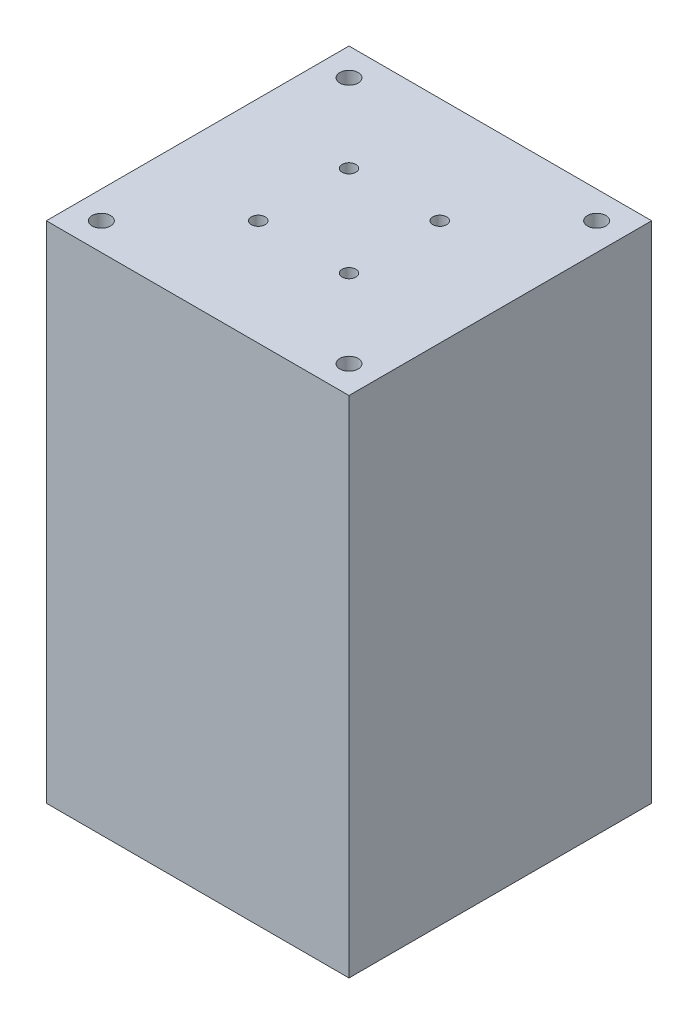
ISO-10303-21;
HEADER;
FILE_DESCRIPTION(('STEP AP214'),'2;1');
FILE_NAME('part.step','',(''),(''),'','','');
FILE_SCHEMA(('AUTOMOTIVE_DESIGN { 1 0 10303 214 1 1 1 1 }'));
ENDSEC;
DATA;
#1=APPLICATION_CONTEXT('core data for automotive mechanical design processes');
#2=APPLICATION_PROTOCOL_DEFINITION('international standard','automotive_design',2000,#1);
#3=PRODUCT_CONTEXT('',#1,'mechanical');
#4=PRODUCT('Part','Part','',(#3));
#5=PRODUCT_RELATED_PRODUCT_CATEGORY('part','',(#4));
#6=PRODUCT_DEFINITION_FORMATION('','',#4);
#7=PRODUCT_DEFINITION_CONTEXT('part definition',#1,'design');
#8=PRODUCT_DEFINITION('design','',#6,#7);
#9=PRODUCT_DEFINITION_SHAPE('','',#8);
#10=(LENGTH_UNIT() NAMED_UNIT(*) SI_UNIT(.MILLI.,.METRE.));
#11=(NAMED_UNIT(*) PLANE_ANGLE_UNIT() SI_UNIT($,.RADIAN.));
#12=(NAMED_UNIT(*) SI_UNIT($,.STERADIAN.) SOLID_ANGLE_UNIT());
#13=UNCERTAINTY_MEASURE_WITH_UNIT(LENGTH_MEASURE(1.E-05),#10,'distance_accuracy_value','');
#14=(GEOMETRIC_REPRESENTATION_CONTEXT(3) GLOBAL_UNCERTAINTY_ASSIGNED_CONTEXT((#13)) GLOBAL_UNIT_ASSIGNED_CONTEXT((#10,
#11,#12)) REPRESENTATION_CONTEXT('',''));
#15=CARTESIAN_POINT('',(0.,0.,0.));
#16=DIRECTION('',(0.,0.,1.));
#17=DIRECTION('',(1.,0.,0.));
#18=AXIS2_PLACEMENT_3D('',#15,#16,#17);
#19=CARTESIAN_POINT('',(0.,0.,0.));
#20=DIRECTION('',(0.,1.,0.));
#21=DIRECTION('',(0.,0.,1.));
#22=AXIS2_PLACEMENT_3D('',#19,#20,#21);
#23=PLANE('',#22);
#24=CARTESIAN_POINT('',(27.,0.,-27.));
#25=DIRECTION('',(0.,1.,0.));
#26=DIRECTION('',(0.,0.,1.));
#27=AXIS2_PLACEMENT_3D('',#24,#25,#26);
#28=CIRCLE('',#27,2.);
#29=CARTESIAN_POINT('',(27.,0.,-25.));
#30=VERTEX_POINT('',#29);
#31=EDGE_CURVE('E347',#30,#30,#28,.T.);
#32=ORIENTED_EDGE('',*,*,#31,.T.);
#33=EDGE_LOOP('',(#32));
#34=FACE_BOUND('',#33,.T.);
#35=CARTESIAN_POINT('',(-27.,0.,27.));
#36=DIRECTION('',(0.,1.,0.));
#37=DIRECTION('',(0.,0.,1.));
#38=AXIS2_PLACEMENT_3D('',#35,#36,#37);
#39=CIRCLE('',#38,2.);
#40=CARTESIAN_POINT('',(-27.,0.,29.));
#41=VERTEX_POINT('',#40);
#42=EDGE_CURVE('E338',#41,#41,#39,.T.);
#43=ORIENTED_EDGE('',*,*,#42,.T.);
#44=EDGE_LOOP('',(#43));
#45=FACE_BOUND('',#44,.T.);
#46=CARTESIAN_POINT('',(27.,0.,27.));
#47=DIRECTION('',(0.,1.,0.));
#48=DIRECTION('',(0.,0.,1.));
#49=AXIS2_PLACEMENT_3D('',#46,#47,#48);
#50=CIRCLE('',#49,2.);
#51=CARTESIAN_POINT('',(27.,0.,29.));
#52=VERTEX_POINT('',#51);
#53=EDGE_CURVE('E333',#52,#52,#50,.T.);
#54=ORIENTED_EDGE('',*,*,#53,.T.);
#55=EDGE_LOOP('',(#54));
#56=FACE_BOUND('',#55,.T.);
#57=DIRECTION('',(0.,0.,1.));
#58=VECTOR('',#57,1.);
#59=CARTESIAN_POINT('',(-33.,0.,0.));
#60=LINE('',#59,#58);
#61=CARTESIAN_POINT('',(-33.,0.,12.5));
#62=VERTEX_POINT('',#61);
#63=CARTESIAN_POINT('',(-33.,0.,33.));
#64=VERTEX_POINT('',#63);
#65=EDGE_CURVE('E456',#62,#64,#60,.T.);
#66=ORIENTED_EDGE('',*,*,#65,.F.);
#67=DIRECTION('',(-1.,0.,0.));
#68=VECTOR('',#67,1.);
#69=CARTESIAN_POINT('',(33.001,0.,12.5));
#70=LINE('',#69,#68);
#71=CARTESIAN_POINT('',(-21.,0.,12.5));
#72=VERTEX_POINT('',#71);
#73=EDGE_CURVE('E273',#72,#62,#70,.T.);
#74=ORIENTED_EDGE('',*,*,#73,.F.);
#75=DIRECTION('',(0.,0.,-1.));
#76=VECTOR('',#75,1.);
#77=CARTESIAN_POINT('',(-21.,0.,0.));
#78=LINE('',#77,#76);
#79=CARTESIAN_POINT('',(-21.,0.,15.));
#80=VERTEX_POINT('',#79);
#81=EDGE_CURVE('E279',#80,#72,#78,.T.);
#82=ORIENTED_EDGE('',*,*,#81,.F.);
#83=DIRECTION('',(0.707106781186544,0.,0.707106781186551));
#84=VECTOR('',#83,1.);
#85=CARTESIAN_POINT('',(-18.0000000000001,0.,17.9999999999999));
#86=LINE('',#85,#84);
#87=CARTESIAN_POINT('',(-15.,0.,21.));
#88=VERTEX_POINT('',#87);
#89=EDGE_CURVE('E533',#80,#88,#86,.T.);
#90=ORIENTED_EDGE('',*,*,#89,.T.);
#91=DIRECTION('',(1.,0.,0.));
#92=VECTOR('',#91,1.);
#93=CARTESIAN_POINT('',(0.,0.,21.));
#94=LINE('',#93,#92);
#95=CARTESIAN_POINT('',(15.,0.,21.));
#96=VERTEX_POINT('',#95);
#97=EDGE_CURVE('E425',#88,#96,#94,.T.);
#98=ORIENTED_EDGE('',*,*,#97,.T.);
#99=DIRECTION('',(0.707106781186551,0.,-0.707106781186544));
#100=VECTOR('',#99,1.);
#101=CARTESIAN_POINT('',(17.9999999999999,0.,18.0000000000001));
#102=LINE('',#101,#100);
#103=CARTESIAN_POINT('',(21.,0.,15.));
#104=VERTEX_POINT('',#103);
#105=EDGE_CURVE('E530',#96,#104,#102,.T.);
#106=ORIENTED_EDGE('',*,*,#105,.T.);
#107=DIRECTION('',(0.,0.,1.));
#108=VECTOR('',#107,1.);
#109=CARTESIAN_POINT('',(21.,0.,0.));
#110=LINE('',#109,#108);
#111=CARTESIAN_POINT('',(21.,0.,-15.));
#112=VERTEX_POINT('',#111);
#113=EDGE_CURVE('E421',#112,#104,#110,.T.);
#114=ORIENTED_EDGE('',*,*,#113,.F.);
#115=DIRECTION('',(0.707106781186544,0.,0.707106781186551));
#116=VECTOR('',#115,1.);
#117=CARTESIAN_POINT('',(18.0000000000001,0.,-17.9999999999999));
#118=LINE('',#117,#116);
#119=CARTESIAN_POINT('',(15.,0.,-21.));
#120=VERTEX_POINT('',#119);
#121=EDGE_CURVE('E125',#112,#120,#118,.F.);
#122=ORIENTED_EDGE('',*,*,#121,.T.);
#123=DIRECTION('',(1.,0.,0.));
#124=VECTOR('',#123,1.);
#125=CARTESIAN_POINT('',(0.,0.,-21.));
#126=LINE('',#125,#124);
#127=CARTESIAN_POINT('',(8.,0.,-21.));
#128=VERTEX_POINT('',#127);
#129=EDGE_CURVE('E396',#128,#120,#126,.T.);
#130=ORIENTED_EDGE('',*,*,#129,.F.);
#131=DIRECTION('',(0.,0.,-1.));
#132=VECTOR('',#131,1.);
#133=CARTESIAN_POINT('',(7.99999999999999,0.,33.001));
#134=LINE('',#133,#132);
#135=CARTESIAN_POINT('',(8.,0.,-33.));
#136=VERTEX_POINT('',#135);
#137=EDGE_CURVE('E321',#128,#136,#134,.T.);
#138=ORIENTED_EDGE('',*,*,#137,.T.);
#139=DIRECTION('',(1.,0.,0.));
#140=VECTOR('',#139,1.);
#141=CARTESIAN_POINT('',(0.,0.,-33.));
#142=LINE('',#141,#140);
#143=CARTESIAN_POINT('',(33.,0.,-33.));
#144=VERTEX_POINT('',#143);
#145=EDGE_CURVE('E451',#136,#144,#142,.T.);
#146=ORIENTED_EDGE('',*,*,#145,.T.);
#147=DIRECTION('',(0.,0.,1.));
#148=VECTOR('',#147,1.);
#149=CARTESIAN_POINT('',(33.,0.,0.));
#150=LINE('',#149,#148);
#151=CARTESIAN_POINT('',(33.,0.,33.));
#152=VERTEX_POINT('',#151);
#153=EDGE_CURVE('E416',#144,#152,#150,.T.);
#154=ORIENTED_EDGE('',*,*,#153,.T.);
#155=DIRECTION('',(1.,0.,0.));
#156=VECTOR('',#155,1.);
#157=CARTESIAN_POINT('',(0.,0.,33.));
#158=LINE('',#157,#156);
#159=EDGE_CURVE('E437',#64,#152,#158,.T.);
#160=ORIENTED_EDGE('',*,*,#159,.F.);
#161=EDGE_LOOP('',(#66,#74,#82,#90,#98,#106,#114,#122,#130,#138,#146,#154,#160));
#162=FACE_BOUND('',#161,.T.);
#163=ADVANCED_FACE('F115',(#34,#45,#56,#162),#23,.F.);
#164=CARTESIAN_POINT('',(-27.,0.,-27.));
#165=DIRECTION('',(0.,1.,0.));
#166=DIRECTION('',(0.,0.,1.));
#167=AXIS2_PLACEMENT_3D('',#164,#165,#166);
#168=CIRCLE('',#167,2.);
#169=CARTESIAN_POINT('',(-27.,0.,-25.));
#170=VERTEX_POINT('',#169);
#171=EDGE_CURVE('E346',#170,#170,#168,.T.);
#172=ORIENTED_EDGE('',*,*,#171,.T.);
#173=EDGE_LOOP('',(#172));
#174=FACE_BOUND('',#173,.T.);
#175=CARTESIAN_POINT('',(-21.,0.,-12.5));
#176=VERTEX_POINT('',#175);
#177=CARTESIAN_POINT('',(-21.,0.,-15.));
#178=VERTEX_POINT('',#177);
#179=EDGE_CURVE('E429',#176,#178,#78,.T.);
#180=ORIENTED_EDGE('',*,*,#179,.F.);
#181=DIRECTION('',(-1.,0.,0.));
#182=VECTOR('',#181,1.);
#183=CARTESIAN_POINT('',(33.001,0.,-12.5));
#184=LINE('',#183,#182);
#185=CARTESIAN_POINT('',(-33.,0.,-12.5));
#186=VERTEX_POINT('',#185);
#187=EDGE_CURVE('E294',#176,#186,#184,.T.);
#188=ORIENTED_EDGE('',*,*,#187,.T.);
#189=CARTESIAN_POINT('',(-33.,0.,-33.));
#190=VERTEX_POINT('',#189);
#191=EDGE_CURVE('E457',#190,#186,#60,.T.);
#192=ORIENTED_EDGE('',*,*,#191,.F.);
#193=CARTESIAN_POINT('',(-8.,0.,-33.));
#194=VERTEX_POINT('',#193);
#195=EDGE_CURVE('E452',#190,#194,#142,.T.);
#196=ORIENTED_EDGE('',*,*,#195,.T.);
#197=DIRECTION('',(0.,0.,-1.));
#198=VECTOR('',#197,1.);
#199=CARTESIAN_POINT('',(-8.,0.,33.001));
#200=LINE('',#199,#198);
#201=CARTESIAN_POINT('',(-8.,0.,-21.));
#202=VERTEX_POINT('',#201);
#203=EDGE_CURVE('E317',#202,#194,#200,.T.);
#204=ORIENTED_EDGE('',*,*,#203,.F.);
#205=CARTESIAN_POINT('',(-15.,0.,-21.));
#206=VERTEX_POINT('',#205);
#207=EDGE_CURVE('E417',#206,#202,#126,.T.);
#208=ORIENTED_EDGE('',*,*,#207,.F.);
#209=DIRECTION('',(0.707106781186551,0.,-0.707106781186544));
#210=VECTOR('',#209,1.);
#211=CARTESIAN_POINT('',(-17.9999999999999,0.,-18.0000000000001));
#212=LINE('',#211,#210);
#213=EDGE_CURVE('E12',#206,#178,#212,.F.);
#214=ORIENTED_EDGE('',*,*,#213,.T.);
#215=EDGE_LOOP('',(#180,#188,#192,#196,#204,#208,#214));
#216=FACE_BOUND('',#215,.T.);
#217=ADVANCED_FACE('F562',(#174,#216),#23,.F.);
#218=CARTESIAN_POINT('',(0.,110.,-33.));
#219=DIRECTION('',(0.,0.,-1.));
#220=DIRECTION('',(-1.,0.,0.));
#221=AXIS2_PLACEMENT_3D('',#218,#219,#220);
#222=PLANE('',#221);
#223=DIRECTION('',(0.,1.,0.));
#224=VECTOR('',#223,1.);
#225=CARTESIAN_POINT('',(-7.99999999999999,25.,-33.));
#226=LINE('',#225,#224);
#227=CARTESIAN_POINT('',(-7.99999999999999,25.,-33.));
#228=VERTEX_POINT('',#227);
#229=EDGE_CURVE('E305',#194,#228,#226,.T.);
#230=ORIENTED_EDGE('',*,*,#229,.F.);
#231=ORIENTED_EDGE('',*,*,#195,.F.);
#232=DIRECTION('',(0.,-1.,0.));
#233=VECTOR('',#232,1.);
#234=CARTESIAN_POINT('',(-33.,110.,-33.));
#235=LINE('',#234,#233);
#236=CARTESIAN_POINT('',(-33.,110.,-33.));
#237=VERTEX_POINT('',#236);
#238=EDGE_CURVE('E470',#237,#190,#235,.T.);
#239=ORIENTED_EDGE('',*,*,#238,.F.);
#240=DIRECTION('',(1.,0.,0.));
#241=VECTOR('',#240,1.);
#242=CARTESIAN_POINT('',(0.,110.,-33.));
#243=LINE('',#242,#241);
#244=CARTESIAN_POINT('',(33.,110.,-33.));
#245=VERTEX_POINT('',#244);
#246=EDGE_CURVE('E436',#237,#245,#243,.T.);
#247=ORIENTED_EDGE('',*,*,#246,.T.);
#248=DIRECTION('',(0.,-1.,0.));
#249=VECTOR('',#248,1.);
#250=CARTESIAN_POINT('',(33.,110.,-33.));
#251=LINE('',#250,#249);
#252=EDGE_CURVE('E473',#245,#144,#251,.T.);
#253=ORIENTED_EDGE('',*,*,#252,.T.);
#254=ORIENTED_EDGE('',*,*,#145,.F.);
#255=DIRECTION('',(0.,-1.,0.));
#256=VECTOR('',#255,1.);
#257=CARTESIAN_POINT('',(8.00000000000001,25.,-33.));
#258=LINE('',#257,#256);
#259=CARTESIAN_POINT('',(8.00000000000001,25.,-33.));
#260=VERTEX_POINT('',#259);
#261=EDGE_CURVE('E313',#260,#136,#258,.T.);
#262=ORIENTED_EDGE('',*,*,#261,.F.);
#263=DIRECTION('',(1.,0.,0.));
#264=VECTOR('',#263,1.);
#265=CARTESIAN_POINT('',(8.00000000000001,25.,-33.));
#266=LINE('',#265,#264);
#267=EDGE_CURVE('E309',#228,#260,#266,.T.);
#268=ORIENTED_EDGE('',*,*,#267,.F.);
#269=EDGE_LOOP('',(#230,#231,#239,#247,#253,#254,#262,#268));
#270=FACE_BOUND('',#269,.T.);
#271=ADVANCED_FACE('F570',(#270),#222,.T.);
#272=CARTESIAN_POINT('',(-33.,110.,0.));
#273=DIRECTION('',(1.,0.,0.));
#274=DIRECTION('',(0.,0.,-1.));
#275=AXIS2_PLACEMENT_3D('',#272,#273,#274);
#276=PLANE('',#275);
#277=DIRECTION('',(0.,0.,-1.));
#278=VECTOR('',#277,1.);
#279=CARTESIAN_POINT('',(-33.,10.,-12.5));
#280=LINE('',#279,#278);
#281=CARTESIAN_POINT('',(-33.,10.,12.5));
#282=VERTEX_POINT('',#281);
#283=CARTESIAN_POINT('',(-33.,10.,-12.5));
#284=VERTEX_POINT('',#283);
#285=EDGE_CURVE('E284',#282,#284,#280,.T.);
#286=ORIENTED_EDGE('',*,*,#285,.F.);
#287=DIRECTION('',(0.,1.,0.));
#288=VECTOR('',#287,1.);
#289=CARTESIAN_POINT('',(-33.,10.,12.5));
#290=LINE('',#289,#288);
#291=EDGE_CURVE('E260',#62,#282,#290,.T.);
#292=ORIENTED_EDGE('',*,*,#291,.F.);
#293=ORIENTED_EDGE('',*,*,#65,.T.);
#294=DIRECTION('',(0.,-1.,0.));
#295=VECTOR('',#294,1.);
#296=CARTESIAN_POINT('',(-33.,110.,33.));
#297=LINE('',#296,#295);
#298=CARTESIAN_POINT('',(-33.,110.,33.));
#299=VERTEX_POINT('',#298);
#300=EDGE_CURVE('E466',#299,#64,#297,.T.);
#301=ORIENTED_EDGE('',*,*,#300,.F.);
#302=DIRECTION('',(0.,0.,1.));
#303=VECTOR('',#302,1.);
#304=CARTESIAN_POINT('',(-33.,110.,0.));
#305=LINE('',#304,#303);
#306=EDGE_CURVE('E441',#237,#299,#305,.T.);
#307=ORIENTED_EDGE('',*,*,#306,.F.);
#308=ORIENTED_EDGE('',*,*,#238,.T.);
#309=ORIENTED_EDGE('',*,*,#191,.T.);
#310=DIRECTION('',(0.,-1.,0.));
#311=VECTOR('',#310,1.);
#312=CARTESIAN_POINT('',(-33.,10.,-12.5));
#313=LINE('',#312,#311);
#314=EDGE_CURVE('E266',#284,#186,#313,.T.);
#315=ORIENTED_EDGE('',*,*,#314,.F.);
#316=EDGE_LOOP('',(#286,#292,#293,#301,#307,#308,#309,#315));
#317=FACE_BOUND('',#316,.T.);
#318=ADVANCED_FACE('F584',(#317),#276,.F.);
#319=CARTESIAN_POINT('',(0.,110.,33.));
#320=DIRECTION('',(0.,0.,-1.));
#321=DIRECTION('',(-1.,0.,0.));
#322=AXIS2_PLACEMENT_3D('',#319,#320,#321);
#323=PLANE('',#322);
#324=ORIENTED_EDGE('',*,*,#159,.T.);
#325=DIRECTION('',(0.,-1.,0.));
#326=VECTOR('',#325,1.);
#327=CARTESIAN_POINT('',(33.,110.,33.));
#328=LINE('',#327,#326);
#329=CARTESIAN_POINT('',(33.,110.,33.));
#330=VERTEX_POINT('',#329);
#331=EDGE_CURVE('E447',#330,#152,#328,.T.);
#332=ORIENTED_EDGE('',*,*,#331,.F.);
#333=DIRECTION('',(1.,0.,0.));
#334=VECTOR('',#333,1.);
#335=CARTESIAN_POINT('',(0.,110.,33.));
#336=LINE('',#335,#334);
#337=EDGE_CURVE('E444',#299,#330,#336,.T.);
#338=ORIENTED_EDGE('',*,*,#337,.F.);
#339=ORIENTED_EDGE('',*,*,#300,.T.);
#340=EDGE_LOOP('',(#324,#332,#338,#339));
#341=FACE_BOUND('',#340,.T.);
#342=ADVANCED_FACE('F597',(#341),#323,.F.);
#343=CARTESIAN_POINT('',(33.,110.,0.));
#344=DIRECTION('',(1.,0.,0.));
#345=DIRECTION('',(0.,0.,-1.));
#346=AXIS2_PLACEMENT_3D('',#343,#344,#345);
#347=PLANE('',#346);
#348=ORIENTED_EDGE('',*,*,#153,.F.);
#349=ORIENTED_EDGE('',*,*,#252,.F.);
#350=DIRECTION('',(0.,0.,1.));
#351=VECTOR('',#350,1.);
#352=CARTESIAN_POINT('',(33.,110.,0.));
#353=LINE('',#352,#351);
#354=EDGE_CURVE('E432',#245,#330,#353,.T.);
#355=ORIENTED_EDGE('',*,*,#354,.T.);
#356=ORIENTED_EDGE('',*,*,#331,.T.);
#357=EDGE_LOOP('',(#348,#349,#355,#356));
#358=FACE_BOUND('',#357,.T.);
#359=ADVANCED_FACE('F594',(#358),#347,.T.);
#360=CARTESIAN_POINT('',(0.,110.,0.));
#361=DIRECTION('',(0.,1.,0.));
#362=DIRECTION('',(0.,0.,1.));
#363=AXIS2_PLACEMENT_3D('',#360,#361,#362);
#364=PLANE('',#363);
#365=CARTESIAN_POINT('',(-27.,110.,-27.));
#366=DIRECTION('',(0.,1.,0.));
#367=DIRECTION('',(0.,0.,1.));
#368=AXIS2_PLACEMENT_3D('',#365,#366,#367);
#369=CIRCLE('',#368,2.);
#370=CARTESIAN_POINT('',(-27.,110.,-25.));
#371=VERTEX_POINT('',#370);
#372=EDGE_CURVE('E363',#371,#371,#369,.T.);
#373=ORIENTED_EDGE('',*,*,#372,.F.);
#374=EDGE_LOOP('',(#373));
#375=FACE_BOUND('',#374,.T.);
#376=CARTESIAN_POINT('',(9.89949493661167,110.,9.89949493661166));
#377=DIRECTION('',(0.,1.,0.));
#378=DIRECTION('',(0.,0.,1.));
#379=AXIS2_PLACEMENT_3D('',#376,#377,#378);
#380=CIRCLE('',#379,1.5);
#381=CARTESIAN_POINT('',(9.89949493661167,110.,11.3994949366117));
#382=VERTEX_POINT('',#381);
#383=EDGE_CURVE('E358',#382,#382,#380,.T.);
#384=ORIENTED_EDGE('',*,*,#383,.F.);
#385=EDGE_LOOP('',(#384));
#386=FACE_BOUND('',#385,.T.);
#387=CARTESIAN_POINT('',(9.89949493661166,110.,-9.89949493661167));
#388=DIRECTION('',(0.,1.,0.));
#389=DIRECTION('',(0.,0.,1.));
#390=AXIS2_PLACEMENT_3D('',#387,#388,#389);
#391=CIRCLE('',#390,1.5);
#392=CARTESIAN_POINT('',(9.89949493661166,110.,-8.39949493661167));
#393=VERTEX_POINT('',#392);
#394=EDGE_CURVE('E362',#393,#393,#391,.T.);
#395=ORIENTED_EDGE('',*,*,#394,.F.);
#396=EDGE_LOOP('',(#395));
#397=FACE_BOUND('',#396,.T.);
#398=CARTESIAN_POINT('',(-9.89949493661167,110.,-9.89949493661166));
#399=DIRECTION('',(0.,1.,0.));
#400=DIRECTION('',(0.,0.,1.));
#401=AXIS2_PLACEMENT_3D('',#398,#399,#400);
#402=CIRCLE('',#401,1.5);
#403=CARTESIAN_POINT('',(-9.89949493661167,110.,-8.39949493661166));
#404=VERTEX_POINT('',#403);
#405=EDGE_CURVE('E370',#404,#404,#402,.T.);
#406=ORIENTED_EDGE('',*,*,#405,.F.);
#407=EDGE_LOOP('',(#406));
#408=FACE_BOUND('',#407,.T.);
#409=CARTESIAN_POINT('',(27.,110.,27.));
#410=DIRECTION('',(0.,1.,0.));
#411=DIRECTION('',(0.,0.,1.));
#412=AXIS2_PLACEMENT_3D('',#409,#410,#411);
#413=CIRCLE('',#412,2.);
#414=CARTESIAN_POINT('',(27.,110.,29.));
#415=VERTEX_POINT('',#414);
#416=EDGE_CURVE('E334',#415,#415,#413,.T.);
#417=ORIENTED_EDGE('',*,*,#416,.F.);
#418=EDGE_LOOP('',(#417));
#419=FACE_BOUND('',#418,.T.);
#420=CARTESIAN_POINT('',(-27.,110.,27.));
#421=DIRECTION('',(0.,1.,0.));
#422=DIRECTION('',(0.,0.,1.));
#423=AXIS2_PLACEMENT_3D('',#420,#421,#422);
#424=CIRCLE('',#423,2.);
#425=CARTESIAN_POINT('',(-27.,110.,29.));
#426=VERTEX_POINT('',#425);
#427=EDGE_CURVE('E351',#426,#426,#424,.T.);
#428=ORIENTED_EDGE('',*,*,#427,.F.);
#429=EDGE_LOOP('',(#428));
#430=FACE_BOUND('',#429,.T.);
#431=CARTESIAN_POINT('',(27.,110.,-27.));
#432=DIRECTION('',(0.,1.,0.));
#433=DIRECTION('',(0.,0.,1.));
#434=AXIS2_PLACEMENT_3D('',#431,#432,#433);
#435=CIRCLE('',#434,2.);
#436=CARTESIAN_POINT('',(27.,110.,-25.));
#437=VERTEX_POINT('',#436);
#438=EDGE_CURVE('E342',#437,#437,#435,.T.);
#439=ORIENTED_EDGE('',*,*,#438,.F.);
#440=EDGE_LOOP('',(#439));
#441=FACE_BOUND('',#440,.T.);
#442=CARTESIAN_POINT('',(-9.89949493661167,110.,9.89949493661166));
#443=DIRECTION('',(0.,1.,0.));
#444=DIRECTION('',(0.,0.,1.));
#445=AXIS2_PLACEMENT_3D('',#442,#443,#444);
#446=CIRCLE('',#445,1.5);
#447=CARTESIAN_POINT('',(-9.89949493661167,110.,11.3994949366117));
#448=VERTEX_POINT('',#447);
#449=EDGE_CURVE('E374',#448,#448,#446,.T.);
#450=ORIENTED_EDGE('',*,*,#449,.F.);
#451=EDGE_LOOP('',(#450));
#452=FACE_BOUND('',#451,.T.);
#453=ORIENTED_EDGE('',*,*,#354,.F.);
#454=ORIENTED_EDGE('',*,*,#246,.F.);
#455=ORIENTED_EDGE('',*,*,#306,.T.);
#456=ORIENTED_EDGE('',*,*,#337,.T.);
#457=EDGE_LOOP('',(#453,#454,#455,#456));
#458=FACE_BOUND('',#457,.T.);
#459=ADVANCED_FACE('F590',(#375,#386,#397,#408,#419,#430,#441,#452,#458),#364,.T.);
#460=CARTESIAN_POINT('',(0.,76.,-21.));
#461=DIRECTION('',(0.,0.,-1.));
#462=DIRECTION('',(-1.,0.,0.));
#463=AXIS2_PLACEMENT_3D('',#460,#461,#462);
#464=PLANE('',#463);
#465=ORIENTED_EDGE('',*,*,#207,.T.);
#466=DIRECTION('',(0.,-1.,0.));
#467=VECTOR('',#466,1.);
#468=CARTESIAN_POINT('',(-7.99999999999999,25.,-21.));
#469=LINE('',#468,#467);
#470=CARTESIAN_POINT('',(-8.,25.,-21.));
#471=VERTEX_POINT('',#470);
#472=EDGE_CURVE('E302',#471,#202,#469,.T.);
#473=ORIENTED_EDGE('',*,*,#472,.F.);
#474=DIRECTION('',(-1.,0.,0.));
#475=VECTOR('',#474,1.);
#476=CARTESIAN_POINT('',(8.,25.,-21.));
#477=LINE('',#476,#475);
#478=CARTESIAN_POINT('',(8.00000000000001,25.,-21.));
#479=VERTEX_POINT('',#478);
#480=EDGE_CURVE('E320',#479,#471,#477,.T.);
#481=ORIENTED_EDGE('',*,*,#480,.F.);
#482=DIRECTION('',(0.,1.,0.));
#483=VECTOR('',#482,1.);
#484=CARTESIAN_POINT('',(8.00000000000001,25.,-21.));
#485=LINE('',#484,#483);
#486=EDGE_CURVE('E140',#128,#479,#485,.T.);
#487=ORIENTED_EDGE('',*,*,#486,.F.);
#488=ORIENTED_EDGE('',*,*,#129,.T.);
#489=DIRECTION('',(0.,1.,0.));
#490=VECTOR('',#489,1.);
#491=CARTESIAN_POINT('',(15.,76.,-21.));
#492=LINE('',#491,#490);
#493=CARTESIAN_POINT('',(15.,76.,-21.));
#494=VERTEX_POINT('',#493);
#495=EDGE_CURVE('E527',#120,#494,#492,.T.);
#496=ORIENTED_EDGE('',*,*,#495,.T.);
#497=DIRECTION('',(1.,0.,0.));
#498=VECTOR('',#497,1.);
#499=CARTESIAN_POINT('',(0.,76.,-21.));
#500=LINE('',#499,#498);
#501=CARTESIAN_POINT('',(-15.,76.,-21.));
#502=VERTEX_POINT('',#501);
#503=EDGE_CURVE('E400',#502,#494,#500,.T.);
#504=ORIENTED_EDGE('',*,*,#503,.F.);
#505=DIRECTION('',(0.,-1.,0.));
#506=VECTOR('',#505,1.);
#507=CARTESIAN_POINT('',(-15.,0.,-21.));
#508=LINE('',#507,#506);
#509=EDGE_CURVE('E523',#502,#206,#508,.T.);
#510=ORIENTED_EDGE('',*,*,#509,.T.);
#511=EDGE_LOOP('',(#465,#473,#481,#487,#488,#496,#504,#510));
#512=FACE_BOUND('',#511,.T.);
#513=ADVANCED_FACE('F548',(#512),#464,.F.);
#514=CARTESIAN_POINT('',(-21.,76.,0.));
#515=DIRECTION('',(-1.,0.,0.));
#516=DIRECTION('',(0.,0.,1.));
#517=AXIS2_PLACEMENT_3D('',#514,#515,#516);
#518=PLANE('',#517);
#519=ORIENTED_EDGE('',*,*,#81,.T.);
#520=DIRECTION('',(0.,-1.,0.));
#521=VECTOR('',#520,1.);
#522=CARTESIAN_POINT('',(-21.,10.,12.5));
#523=LINE('',#522,#521);
#524=CARTESIAN_POINT('',(-21.,10.,12.5));
#525=VERTEX_POINT('',#524);
#526=EDGE_CURVE('E257',#525,#72,#523,.T.);
#527=ORIENTED_EDGE('',*,*,#526,.F.);
#528=DIRECTION('',(0.,0.,1.));
#529=VECTOR('',#528,1.);
#530=CARTESIAN_POINT('',(-21.,10.,-12.5));
#531=LINE('',#530,#529);
#532=CARTESIAN_POINT('',(-21.,9.99999999999999,-12.5));
#533=VERTEX_POINT('',#532);
#534=EDGE_CURVE('E269',#533,#525,#531,.T.);
#535=ORIENTED_EDGE('',*,*,#534,.F.);
#536=DIRECTION('',(0.,1.,0.));
#537=VECTOR('',#536,1.);
#538=CARTESIAN_POINT('',(-21.,10.,-12.5));
#539=LINE('',#538,#537);
#540=EDGE_CURVE('E132',#176,#533,#539,.T.);
#541=ORIENTED_EDGE('',*,*,#540,.F.);
#542=ORIENTED_EDGE('',*,*,#179,.T.);
#543=DIRECTION('',(0.,1.,0.));
#544=VECTOR('',#543,1.);
#545=CARTESIAN_POINT('',(-21.,76.,-15.));
#546=LINE('',#545,#544);
#547=CARTESIAN_POINT('',(-21.,76.,-15.));
#548=VERTEX_POINT('',#547);
#549=EDGE_CURVE('E517',#178,#548,#546,.T.);
#550=ORIENTED_EDGE('',*,*,#549,.T.);
#551=DIRECTION('',(0.,0.,-1.));
#552=VECTOR('',#551,1.);
#553=CARTESIAN_POINT('',(-21.,76.,0.));
#554=LINE('',#553,#552);
#555=CARTESIAN_POINT('',(-21.,76.,15.));
#556=VERTEX_POINT('',#555);
#557=EDGE_CURVE('E412',#556,#548,#554,.T.);
#558=ORIENTED_EDGE('',*,*,#557,.F.);
#559=DIRECTION('',(0.,-1.,0.));
#560=VECTOR('',#559,1.);
#561=CARTESIAN_POINT('',(-21.,76.,15.));
#562=LINE('',#561,#560);
#563=EDGE_CURVE('E520',#556,#80,#562,.T.);
#564=ORIENTED_EDGE('',*,*,#563,.T.);
#565=EDGE_LOOP('',(#519,#527,#535,#541,#542,#550,#558,#564));
#566=FACE_BOUND('',#565,.T.);
#567=ADVANCED_FACE('F276',(#566),#518,.F.);
#568=CARTESIAN_POINT('',(0.,76.,21.));
#569=DIRECTION('',(0.,0.,-1.));
#570=DIRECTION('',(-1.,0.,0.));
#571=AXIS2_PLACEMENT_3D('',#568,#569,#570);
#572=PLANE('',#571);
#573=DIRECTION('',(1.,0.,0.));
#574=VECTOR('',#573,1.);
#575=CARTESIAN_POINT('',(0.,76.,21.));
#576=LINE('',#575,#574);
#577=CARTESIAN_POINT('',(-15.,76.,21.));
#578=VERTEX_POINT('',#577);
#579=CARTESIAN_POINT('',(15.,76.,21.));
#580=VERTEX_POINT('',#579);
#581=EDGE_CURVE('E408',#578,#580,#576,.T.);
#582=ORIENTED_EDGE('',*,*,#581,.T.);
#583=DIRECTION('',(0.,-1.,0.));
#584=VECTOR('',#583,1.);
#585=CARTESIAN_POINT('',(15.,76.,21.));
#586=LINE('',#585,#584);
#587=EDGE_CURVE('E494',#580,#96,#586,.T.);
#588=ORIENTED_EDGE('',*,*,#587,.T.);
#589=ORIENTED_EDGE('',*,*,#97,.F.);
#590=DIRECTION('',(0.,1.,0.));
#591=VECTOR('',#590,1.);
#592=CARTESIAN_POINT('',(-15.,76.,21.));
#593=LINE('',#592,#591);
#594=EDGE_CURVE('E477',#88,#578,#593,.T.);
#595=ORIENTED_EDGE('',*,*,#594,.T.);
#596=EDGE_LOOP('',(#582,#588,#589,#595));
#597=FACE_BOUND('',#596,.T.);
#598=ADVANCED_FACE('F627',(#597),#572,.T.);
#599=CARTESIAN_POINT('',(21.,76.,0.));
#600=DIRECTION('',(1.,0.,0.));
#601=DIRECTION('',(0.,0.,-1.));
#602=AXIS2_PLACEMENT_3D('',#599,#600,#601);
#603=PLANE('',#602);
#604=ORIENTED_EDGE('',*,*,#113,.T.);
#605=DIRECTION('',(0.,1.,0.));
#606=VECTOR('',#605,1.);
#607=CARTESIAN_POINT('',(21.,76.,15.));
#608=LINE('',#607,#606);
#609=CARTESIAN_POINT('',(21.,76.,15.));
#610=VERTEX_POINT('',#609);
#611=EDGE_CURVE('E502',#104,#610,#608,.T.);
#612=ORIENTED_EDGE('',*,*,#611,.T.);
#613=DIRECTION('',(0.,0.,1.));
#614=VECTOR('',#613,1.);
#615=CARTESIAN_POINT('',(21.,76.,0.));
#616=LINE('',#615,#614);
#617=CARTESIAN_POINT('',(21.,76.,-15.));
#618=VERTEX_POINT('',#617);
#619=EDGE_CURVE('E404',#618,#610,#616,.T.);
#620=ORIENTED_EDGE('',*,*,#619,.F.);
#621=DIRECTION('',(0.,-1.,0.));
#622=VECTOR('',#621,1.);
#623=CARTESIAN_POINT('',(21.,0.,-15.));
#624=LINE('',#623,#622);
#625=EDGE_CURVE('E498',#618,#112,#624,.T.);
#626=ORIENTED_EDGE('',*,*,#625,.T.);
#627=EDGE_LOOP('',(#604,#612,#620,#626));
#628=FACE_BOUND('',#627,.T.);
#629=ADVANCED_FACE('F624',(#628),#603,.F.);
#630=CARTESIAN_POINT('',(0.,76.,0.));
#631=DIRECTION('',(0.,-1.,0.));
#632=DIRECTION('',(0.,0.,-1.));
#633=AXIS2_PLACEMENT_3D('',#630,#631,#632);
#634=PLANE('',#633);
#635=CARTESIAN_POINT('',(0.,76.,0.));
#636=DIRECTION('',(0.,-1.,0.));
#637=DIRECTION('',(0.,0.,-1.));
#638=AXIS2_PLACEMENT_3D('',#635,#636,#637);
#639=CIRCLE('',#638,18.);
#640=CARTESIAN_POINT('',(0.,76.,-18.));
#641=VERTEX_POINT('',#640);
#642=EDGE_CURVE('E386',#641,#641,#639,.T.);
#643=ORIENTED_EDGE('',*,*,#642,.F.);
#644=EDGE_LOOP('',(#643));
#645=FACE_BOUND('',#644,.T.);
#646=ORIENTED_EDGE('',*,*,#619,.T.);
#647=DIRECTION('',(-0.707106781186551,0.,0.707106781186544));
#648=VECTOR('',#647,1.);
#649=CARTESIAN_POINT('',(17.9999999999999,76.,18.0000000000001));
#650=LINE('',#649,#648);
#651=EDGE_CURVE('E514',#610,#580,#650,.T.);
#652=ORIENTED_EDGE('',*,*,#651,.T.);
#653=ORIENTED_EDGE('',*,*,#581,.F.);
#654=DIRECTION('',(-0.707106781186544,0.,-0.707106781186551));
#655=VECTOR('',#654,1.);
#656=CARTESIAN_POINT('',(-18.0000000000001,76.,17.9999999999999));
#657=LINE('',#656,#655);
#658=EDGE_CURVE('E511',#578,#556,#657,.T.);
#659=ORIENTED_EDGE('',*,*,#658,.T.);
#660=ORIENTED_EDGE('',*,*,#557,.T.);
#661=DIRECTION('',(-0.707106781186551,0.,0.707106781186544));
#662=VECTOR('',#661,1.);
#663=CARTESIAN_POINT('',(-17.9999999999999,76.,-18.0000000000001));
#664=LINE('',#663,#662);
#665=EDGE_CURVE('E505',#548,#502,#664,.F.);
#666=ORIENTED_EDGE('',*,*,#665,.T.);
#667=ORIENTED_EDGE('',*,*,#503,.T.);
#668=DIRECTION('',(-0.707106781186544,0.,-0.707106781186551));
#669=VECTOR('',#668,1.);
#670=CARTESIAN_POINT('',(18.0000000000001,76.,-17.9999999999999));
#671=LINE('',#670,#669);
#672=EDGE_CURVE('E508',#494,#618,#671,.F.);
#673=ORIENTED_EDGE('',*,*,#672,.T.);
#674=EDGE_LOOP('',(#646,#652,#653,#659,#660,#666,#667,#673));
#675=FACE_BOUND('',#674,.T.);
#676=ADVANCED_FACE('F551',(#645,#675),#634,.T.);
#677=CARTESIAN_POINT('',(0.,104.,0.));
#678=DIRECTION('',(0.,-1.,0.));
#679=DIRECTION('',(0.,0.,-1.));
#680=AXIS2_PLACEMENT_3D('',#677,#678,#679);
#681=CYLINDRICAL_SURFACE('',#680,18.);
#682=CARTESIAN_POINT('',(0.,104.,0.));
#683=DIRECTION('',(0.,-1.,0.));
#684=DIRECTION('',(0.,0.,-1.));
#685=AXIS2_PLACEMENT_3D('',#682,#683,#684);
#686=CIRCLE('',#685,18.);
#687=CARTESIAN_POINT('',(0.,104.,-18.));
#688=VERTEX_POINT('',#687);
#689=EDGE_CURVE('E392',#688,#688,#686,.T.);
#690=ORIENTED_EDGE('',*,*,#689,.F.);
#691=EDGE_LOOP('',(#690));
#692=FACE_BOUND('',#691,.T.);
#693=ORIENTED_EDGE('',*,*,#642,.T.);
#694=EDGE_LOOP('',(#693));
#695=FACE_BOUND('',#694,.T.);
#696=ADVANCED_FACE('F636',(#692,#695),#681,.F.);
#697=CARTESIAN_POINT('',(0.,104.,0.));
#698=DIRECTION('',(0.,-1.,0.));
#699=DIRECTION('',(0.,0.,-1.));
#700=AXIS2_PLACEMENT_3D('',#697,#698,#699);
#701=PLANE('',#700);
#702=CARTESIAN_POINT('',(9.89949493661167,104.,9.89949493661166));
#703=DIRECTION('',(0.,-1.,0.));
#704=DIRECTION('',(0.,0.,-1.));
#705=AXIS2_PLACEMENT_3D('',#702,#703,#704);
#706=CIRCLE('',#705,1.5);
#707=CARTESIAN_POINT('',(9.89949493661167,104.,8.39949493661166));
#708=VERTEX_POINT('',#707);
#709=EDGE_CURVE('E391',#708,#708,#706,.T.);
#710=ORIENTED_EDGE('',*,*,#709,.F.);
#711=EDGE_LOOP('',(#710));
#712=FACE_BOUND('',#711,.T.);
#713=CARTESIAN_POINT('',(9.89949493661166,104.,-9.89949493661167));
#714=DIRECTION('',(0.,-1.,0.));
#715=DIRECTION('',(0.,0.,-1.));
#716=AXIS2_PLACEMENT_3D('',#713,#714,#715);
#717=CIRCLE('',#716,1.5);
#718=CARTESIAN_POINT('',(9.89949493661166,104.,-11.3994949366117));
#719=VERTEX_POINT('',#718);
#720=EDGE_CURVE('E485',#719,#719,#717,.T.);
#721=ORIENTED_EDGE('',*,*,#720,.F.);
#722=EDGE_LOOP('',(#721));
#723=FACE_BOUND('',#722,.T.);
#724=CARTESIAN_POINT('',(-9.89949493661167,104.,-9.89949493661166));
#725=DIRECTION('',(0.,-1.,0.));
#726=DIRECTION('',(0.,0.,-1.));
#727=AXIS2_PLACEMENT_3D('',#724,#725,#726);
#728=CIRCLE('',#727,1.5);
#729=CARTESIAN_POINT('',(-9.89949493661167,104.,-11.3994949366117));
#730=VERTEX_POINT('',#729);
#731=EDGE_CURVE('E481',#730,#730,#728,.T.);
#732=ORIENTED_EDGE('',*,*,#731,.F.);
#733=EDGE_LOOP('',(#732));
#734=FACE_BOUND('',#733,.T.);
#735=CARTESIAN_POINT('',(-9.89949493661167,104.,9.89949493661166));
#736=DIRECTION('',(0.,-1.,0.));
#737=DIRECTION('',(0.,0.,-1.));
#738=AXIS2_PLACEMENT_3D('',#735,#736,#737);
#739=CIRCLE('',#738,1.5);
#740=CARTESIAN_POINT('',(-9.89949493661167,104.,8.39949493661166));
#741=VERTEX_POINT('',#740);
#742=EDGE_CURVE('E381',#741,#741,#739,.T.);
#743=ORIENTED_EDGE('',*,*,#742,.F.);
#744=EDGE_LOOP('',(#743));
#745=FACE_BOUND('',#744,.T.);
#746=CARTESIAN_POINT('',(0.,104.,0.));
#747=DIRECTION('',(0.,-1.,0.));
#748=DIRECTION('',(0.,0.,-1.));
#749=AXIS2_PLACEMENT_3D('',#746,#747,#748);
#750=CIRCLE('',#749,11.);
#751=CARTESIAN_POINT('',(0.,104.,-11.));
#752=VERTEX_POINT('',#751);
#753=EDGE_CURVE('E387',#752,#752,#750,.T.);
#754=ORIENTED_EDGE('',*,*,#753,.F.);
#755=EDGE_LOOP('',(#754));
#756=FACE_BOUND('',#755,.T.);
#757=ORIENTED_EDGE('',*,*,#689,.T.);
#758=EDGE_LOOP('',(#757));
#759=FACE_BOUND('',#758,.T.);
#760=ADVANCED_FACE('F640',(#712,#723,#734,#745,#756,#759),#701,.T.);
#761=CARTESIAN_POINT('',(0.,106.,0.));
#762=DIRECTION('',(0.,-1.,0.));
#763=DIRECTION('',(0.,0.,-1.));
#764=AXIS2_PLACEMENT_3D('',#761,#762,#763);
#765=CYLINDRICAL_SURFACE('',#764,11.);
#766=CARTESIAN_POINT('',(0.,106.,0.));
#767=DIRECTION('',(0.,-1.,0.));
#768=DIRECTION('',(0.,0.,-1.));
#769=AXIS2_PLACEMENT_3D('',#766,#767,#768);
#770=CIRCLE('',#769,11.);
#771=CARTESIAN_POINT('',(0.,106.,-11.));
#772=VERTEX_POINT('',#771);
#773=EDGE_CURVE('E382',#772,#772,#770,.T.);
#774=ORIENTED_EDGE('',*,*,#773,.F.);
#775=EDGE_LOOP('',(#774));
#776=FACE_BOUND('',#775,.T.);
#777=ORIENTED_EDGE('',*,*,#753,.T.);
#778=EDGE_LOOP('',(#777));
#779=FACE_BOUND('',#778,.T.);
#780=ADVANCED_FACE('F644',(#776,#779),#765,.F.);
#781=CARTESIAN_POINT('',(0.,106.,0.));
#782=DIRECTION('',(0.,-1.,0.));
#783=DIRECTION('',(0.,0.,-1.));
#784=AXIS2_PLACEMENT_3D('',#781,#782,#783);
#785=PLANE('',#784);
#786=ORIENTED_EDGE('',*,*,#773,.T.);
#787=EDGE_LOOP('',(#786));
#788=FACE_BOUND('',#787,.T.);
#789=ADVANCED_FACE('F648',(#788),#785,.T.);
#790=CARTESIAN_POINT('',(-9.89949493661167,0.,9.89949493661166));
#791=DIRECTION('',(0.,1.,0.));
#792=DIRECTION('',(0.,0.,1.));
#793=AXIS2_PLACEMENT_3D('',#790,#791,#792);
#794=CYLINDRICAL_SURFACE('',#793,1.5);
#795=ORIENTED_EDGE('',*,*,#742,.T.);
#796=EDGE_LOOP('',(#795));
#797=FACE_BOUND('',#796,.T.);
#798=ORIENTED_EDGE('',*,*,#449,.T.);
#799=EDGE_LOOP('',(#798));
#800=FACE_BOUND('',#799,.T.);
#801=ADVANCED_FACE('F652',(#797,#800),#794,.F.);
#802=CARTESIAN_POINT('',(-9.89949493661167,0.,-9.89949493661166));
#803=DIRECTION('',(0.,1.,0.));
#804=DIRECTION('',(0.,0.,1.));
#805=AXIS2_PLACEMENT_3D('',#802,#803,#804);
#806=CYLINDRICAL_SURFACE('',#805,1.5);
#807=ORIENTED_EDGE('',*,*,#731,.T.);
#808=EDGE_LOOP('',(#807));
#809=FACE_BOUND('',#808,.T.);
#810=ORIENTED_EDGE('',*,*,#405,.T.);
#811=EDGE_LOOP('',(#810));
#812=FACE_BOUND('',#811,.T.);
#813=ADVANCED_FACE('F656',(#809,#812),#806,.F.);
#814=CARTESIAN_POINT('',(9.89949493661166,0.,-9.89949493661167));
#815=DIRECTION('',(0.,1.,0.));
#816=DIRECTION('',(0.,0.,1.));
#817=AXIS2_PLACEMENT_3D('',#814,#815,#816);
#818=CYLINDRICAL_SURFACE('',#817,1.5);
#819=ORIENTED_EDGE('',*,*,#720,.T.);
#820=EDGE_LOOP('',(#819));
#821=FACE_BOUND('',#820,.T.);
#822=ORIENTED_EDGE('',*,*,#394,.T.);
#823=EDGE_LOOP('',(#822));
#824=FACE_BOUND('',#823,.T.);
#825=ADVANCED_FACE('F658',(#821,#824),#818,.F.);
#826=CARTESIAN_POINT('',(9.89949493661167,0.,9.89949493661166));
#827=DIRECTION('',(0.,1.,0.));
#828=DIRECTION('',(0.,0.,1.));
#829=AXIS2_PLACEMENT_3D('',#826,#827,#828);
#830=CYLINDRICAL_SURFACE('',#829,1.5);
#831=ORIENTED_EDGE('',*,*,#709,.T.);
#832=EDGE_LOOP('',(#831));
#833=FACE_BOUND('',#832,.T.);
#834=ORIENTED_EDGE('',*,*,#383,.T.);
#835=EDGE_LOOP('',(#834));
#836=FACE_BOUND('',#835,.T.);
#837=ADVANCED_FACE('F661',(#833,#836),#830,.F.);
#838=CARTESIAN_POINT('',(27.,0.,-27.));
#839=DIRECTION('',(0.,1.,0.));
#840=DIRECTION('',(0.,0.,1.));
#841=AXIS2_PLACEMENT_3D('',#838,#839,#840);
#842=CYLINDRICAL_SURFACE('',#841,2.);
#843=ORIENTED_EDGE('',*,*,#31,.F.);
#844=EDGE_LOOP('',(#843));
#845=FACE_BOUND('',#844,.T.);
#846=ORIENTED_EDGE('',*,*,#438,.T.);
#847=EDGE_LOOP('',(#846));
#848=FACE_BOUND('',#847,.T.);
#849=ADVANCED_FACE('F674',(#845,#848),#842,.F.);
#850=CARTESIAN_POINT('',(-27.,0.,27.));
#851=DIRECTION('',(0.,1.,0.));
#852=DIRECTION('',(0.,0.,1.));
#853=AXIS2_PLACEMENT_3D('',#850,#851,#852);
#854=CYLINDRICAL_SURFACE('',#853,2.);
#855=ORIENTED_EDGE('',*,*,#42,.F.);
#856=EDGE_LOOP('',(#855));
#857=FACE_BOUND('',#856,.T.);
#858=ORIENTED_EDGE('',*,*,#427,.T.);
#859=EDGE_LOOP('',(#858));
#860=FACE_BOUND('',#859,.T.);
#861=ADVANCED_FACE('F676',(#857,#860),#854,.F.);
#862=CARTESIAN_POINT('',(27.,0.,27.));
#863=DIRECTION('',(0.,1.,0.));
#864=DIRECTION('',(0.,0.,1.));
#865=AXIS2_PLACEMENT_3D('',#862,#863,#864);
#866=CYLINDRICAL_SURFACE('',#865,2.);
#867=ORIENTED_EDGE('',*,*,#53,.F.);
#868=EDGE_LOOP('',(#867));
#869=FACE_BOUND('',#868,.T.);
#870=ORIENTED_EDGE('',*,*,#416,.T.);
#871=EDGE_LOOP('',(#870));
#872=FACE_BOUND('',#871,.T.);
#873=ADVANCED_FACE('F670',(#869,#872),#866,.F.);
#874=CARTESIAN_POINT('',(-27.,0.,-27.));
#875=DIRECTION('',(0.,1.,0.));
#876=DIRECTION('',(0.,0.,1.));
#877=AXIS2_PLACEMENT_3D('',#874,#875,#876);
#878=CYLINDRICAL_SURFACE('',#877,2.);
#879=ORIENTED_EDGE('',*,*,#171,.F.);
#880=EDGE_LOOP('',(#879));
#881=FACE_BOUND('',#880,.T.);
#882=ORIENTED_EDGE('',*,*,#372,.T.);
#883=EDGE_LOOP('',(#882));
#884=FACE_BOUND('',#883,.T.);
#885=ADVANCED_FACE('F666',(#881,#884),#878,.F.);
#886=CARTESIAN_POINT('',(15.,76.,21.));
#887=DIRECTION('',(0.707106781186544,0.,0.707106781186551));
#888=DIRECTION('',(0.,-1.,0.));
#889=AXIS2_PLACEMENT_3D('',#886,#887,#888);
#890=PLANE('',#889);
#891=ORIENTED_EDGE('',*,*,#651,.F.);
#892=ORIENTED_EDGE('',*,*,#611,.F.);
#893=ORIENTED_EDGE('',*,*,#105,.F.);
#894=ORIENTED_EDGE('',*,*,#587,.F.);
#895=EDGE_LOOP('',(#891,#892,#893,#894));
#896=FACE_BOUND('',#895,.T.);
#897=ADVANCED_FACE('F669',(#896),#890,.F.);
#898=CARTESIAN_POINT('',(-21.,76.,15.));
#899=DIRECTION('',(-0.707106781186551,0.,0.707106781186544));
#900=DIRECTION('',(0.,-1.,0.));
#901=AXIS2_PLACEMENT_3D('',#898,#899,#900);
#902=PLANE('',#901);
#903=ORIENTED_EDGE('',*,*,#658,.F.);
#904=ORIENTED_EDGE('',*,*,#594,.F.);
#905=ORIENTED_EDGE('',*,*,#89,.F.);
#906=ORIENTED_EDGE('',*,*,#563,.F.);
#907=EDGE_LOOP('',(#903,#904,#905,#906));
#908=FACE_BOUND('',#907,.T.);
#909=ADVANCED_FACE('F751',(#908),#902,.F.);
#910=CARTESIAN_POINT('',(21.,76.,-15.));
#911=DIRECTION('',(-0.707106781186551,0.,0.707106781186544));
#912=DIRECTION('',(0.,1.,0.));
#913=AXIS2_PLACEMENT_3D('',#910,#911,#912);
#914=PLANE('',#913);
#915=ORIENTED_EDGE('',*,*,#672,.F.);
#916=ORIENTED_EDGE('',*,*,#495,.F.);
#917=ORIENTED_EDGE('',*,*,#121,.F.);
#918=ORIENTED_EDGE('',*,*,#625,.F.);
#919=EDGE_LOOP('',(#915,#916,#917,#918));
#920=FACE_BOUND('',#919,.T.);
#921=ADVANCED_FACE('F545',(#920),#914,.T.);
#922=CARTESIAN_POINT('',(-15.,76.,-21.));
#923=DIRECTION('',(0.707106781186544,0.,0.707106781186551));
#924=DIRECTION('',(0.,1.,0.));
#925=AXIS2_PLACEMENT_3D('',#922,#923,#924);
#926=PLANE('',#925);
#927=ORIENTED_EDGE('',*,*,#665,.F.);
#928=ORIENTED_EDGE('',*,*,#549,.F.);
#929=ORIENTED_EDGE('',*,*,#213,.F.);
#930=ORIENTED_EDGE('',*,*,#509,.F.);
#931=EDGE_LOOP('',(#927,#928,#929,#930));
#932=FACE_BOUND('',#931,.T.);
#933=ADVANCED_FACE('F118',(#932),#926,.T.);
#934=CARTESIAN_POINT('',(-8.,25.,33.001));
#935=DIRECTION('',(-1.,0.,0.));
#936=DIRECTION('',(0.,-1.,0.));
#937=AXIS2_PLACEMENT_3D('',#934,#935,#936);
#938=PLANE('',#937);
#939=ORIENTED_EDGE('',*,*,#472,.T.);
#940=ORIENTED_EDGE('',*,*,#203,.T.);
#941=ORIENTED_EDGE('',*,*,#229,.T.);
#942=DIRECTION('',(0.,0.,-1.));
#943=VECTOR('',#942,1.);
#944=CARTESIAN_POINT('',(-8.,25.,33.001));
#945=LINE('',#944,#943);
#946=EDGE_CURVE('E316',#471,#228,#945,.T.);
#947=ORIENTED_EDGE('',*,*,#946,.F.);
#948=EDGE_LOOP('',(#939,#940,#941,#947));
#949=FACE_BOUND('',#948,.T.);
#950=ADVANCED_FACE('F567',(#949),#938,.F.);
#951=CARTESIAN_POINT('',(8.,25.,33.001));
#952=DIRECTION('',(1.,0.,0.));
#953=DIRECTION('',(0.,1.,0.));
#954=AXIS2_PLACEMENT_3D('',#951,#952,#953);
#955=PLANE('',#954);
#956=ORIENTED_EDGE('',*,*,#486,.T.);
#957=DIRECTION('',(0.,0.,-1.));
#958=VECTOR('',#957,1.);
#959=CARTESIAN_POINT('',(8.,25.,33.001));
#960=LINE('',#959,#958);
#961=EDGE_CURVE('E325',#479,#260,#960,.T.);
#962=ORIENTED_EDGE('',*,*,#961,.T.);
#963=ORIENTED_EDGE('',*,*,#261,.T.);
#964=ORIENTED_EDGE('',*,*,#137,.F.);
#965=EDGE_LOOP('',(#956,#962,#963,#964));
#966=FACE_BOUND('',#965,.T.);
#967=ADVANCED_FACE('F576',(#966),#955,.F.);
#968=CARTESIAN_POINT('',(8.,25.,33.001));
#969=DIRECTION('',(0.,1.,0.));
#970=DIRECTION('',(0.,0.,1.));
#971=AXIS2_PLACEMENT_3D('',#968,#969,#970);
#972=PLANE('',#971);
#973=ORIENTED_EDGE('',*,*,#480,.T.);
#974=ORIENTED_EDGE('',*,*,#946,.T.);
#975=ORIENTED_EDGE('',*,*,#267,.T.);
#976=ORIENTED_EDGE('',*,*,#961,.F.);
#977=EDGE_LOOP('',(#973,#974,#975,#976));
#978=FACE_BOUND('',#977,.T.);
#979=ADVANCED_FACE('F574',(#978),#972,.F.);
#980=CARTESIAN_POINT('',(33.001,10.,12.5));
#981=DIRECTION('',(0.,0.,1.));
#982=DIRECTION('',(0.,-1.,0.));
#983=AXIS2_PLACEMENT_3D('',#980,#981,#982);
#984=PLANE('',#983);
#985=ORIENTED_EDGE('',*,*,#526,.T.);
#986=ORIENTED_EDGE('',*,*,#73,.T.);
#987=ORIENTED_EDGE('',*,*,#291,.T.);
#988=DIRECTION('',(-1.,0.,0.));
#989=VECTOR('',#988,1.);
#990=CARTESIAN_POINT('',(33.001,10.,12.5));
#991=LINE('',#990,#989);
#992=EDGE_CURVE('E253',#525,#282,#991,.T.);
#993=ORIENTED_EDGE('',*,*,#992,.F.);
#994=EDGE_LOOP('',(#985,#986,#987,#993));
#995=FACE_BOUND('',#994,.T.);
#996=ADVANCED_FACE('F255',(#995),#984,.F.);
#997=CARTESIAN_POINT('',(33.001,10.,-12.5));
#998=DIRECTION('',(0.,0.,-1.));
#999=DIRECTION('',(0.,1.,0.));
#1000=AXIS2_PLACEMENT_3D('',#997,#998,#999);
#1001=PLANE('',#1000);
#1002=ORIENTED_EDGE('',*,*,#540,.T.);
#1003=DIRECTION('',(-1.,0.,0.));
#1004=VECTOR('',#1003,1.);
#1005=CARTESIAN_POINT('',(33.001,10.,-12.5));
#1006=LINE('',#1005,#1004);
#1007=EDGE_CURVE('E265',#533,#284,#1006,.T.);
#1008=ORIENTED_EDGE('',*,*,#1007,.T.);
#1009=ORIENTED_EDGE('',*,*,#314,.T.);
#1010=ORIENTED_EDGE('',*,*,#187,.F.);
#1011=EDGE_LOOP('',(#1002,#1008,#1009,#1010));
#1012=FACE_BOUND('',#1011,.T.);
#1013=ADVANCED_FACE('F694',(#1012),#1001,.F.);
#1014=CARTESIAN_POINT('',(33.001,10.,-12.5));
#1015=DIRECTION('',(0.,1.,0.));
#1016=DIRECTION('',(0.,0.,1.));
#1017=AXIS2_PLACEMENT_3D('',#1014,#1015,#1016);
#1018=PLANE('',#1017);
#1019=ORIENTED_EDGE('',*,*,#534,.T.);
#1020=ORIENTED_EDGE('',*,*,#992,.T.);
#1021=ORIENTED_EDGE('',*,*,#285,.T.);
#1022=ORIENTED_EDGE('',*,*,#1007,.F.);
#1023=EDGE_LOOP('',(#1019,#1020,#1021,#1022));
#1024=FACE_BOUND('',#1023,.T.);
#1025=ADVANCED_FACE('F270',(#1024),#1018,.F.);
#1026=CLOSED_SHELL('',(#163,#217,#271,#318,#342,#359,#459,#513,#567,#598,#629,#676,#696,#760,
#780,#789,#801,#813,#825,#837,#849,#861,#873,#885,#897,#909,#921,#933,#950,#967,#979,#996,#1013,#1025));
#1027=MANIFOLD_SOLID_BREP('B2',#1026);
#1028=ADVANCED_BREP_SHAPE_REPRESENTATION('',(#18,#1027),#14);
#1029=SHAPE_DEFINITION_REPRESENTATION(#9,#1028);
ENDSEC;
END-ISO-10303-21;
